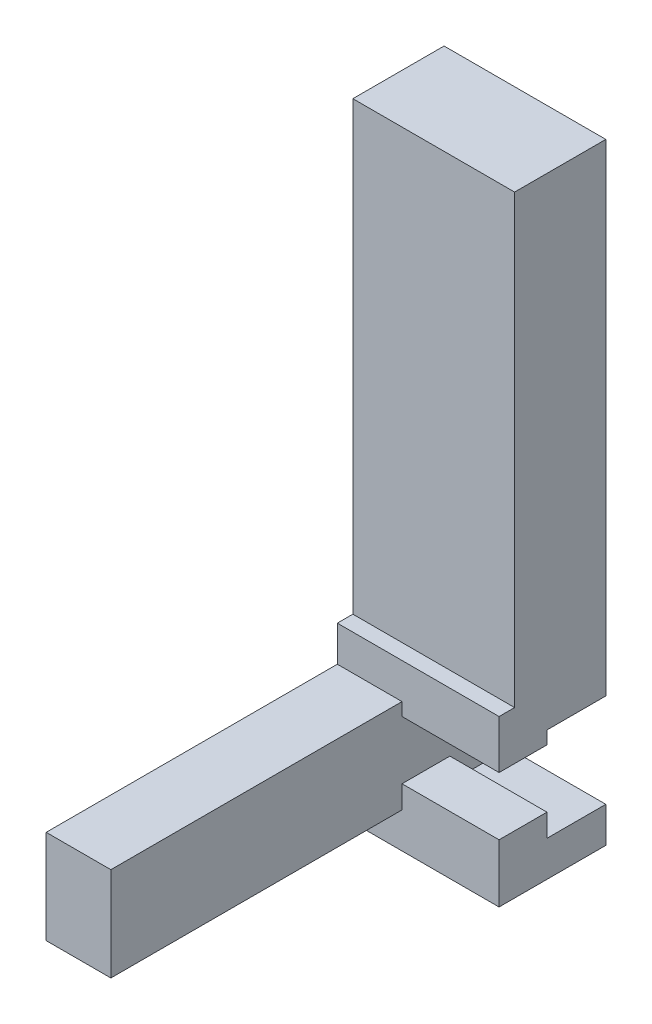
ISO-10303-21;
HEADER;
FILE_DESCRIPTION(('STEP AP214'),'2;1');
FILE_NAME('part.step','',(''),(''),'','','');
FILE_SCHEMA(('AUTOMOTIVE_DESIGN { 1 0 10303 214 1 1 1 1 }'));
ENDSEC;
DATA;
#1=APPLICATION_CONTEXT('core data for automotive mechanical design processes');
#2=APPLICATION_PROTOCOL_DEFINITION('international standard','automotive_design',2000,#1);
#3=PRODUCT_CONTEXT('',#1,'mechanical');
#4=PRODUCT('Part','Part','',(#3));
#5=PRODUCT_RELATED_PRODUCT_CATEGORY('part','',(#4));
#6=PRODUCT_DEFINITION_FORMATION('','',#4);
#7=PRODUCT_DEFINITION_CONTEXT('part definition',#1,'design');
#8=PRODUCT_DEFINITION('design','',#6,#7);
#9=PRODUCT_DEFINITION_SHAPE('','',#8);
#10=(LENGTH_UNIT() NAMED_UNIT(*) SI_UNIT(.MILLI.,.METRE.));
#11=(NAMED_UNIT(*) PLANE_ANGLE_UNIT() SI_UNIT($,.RADIAN.));
#12=(NAMED_UNIT(*) SI_UNIT($,.STERADIAN.) SOLID_ANGLE_UNIT());
#13=UNCERTAINTY_MEASURE_WITH_UNIT(LENGTH_MEASURE(1.E-05),#10,'distance_accuracy_value','');
#14=(GEOMETRIC_REPRESENTATION_CONTEXT(3) GLOBAL_UNCERTAINTY_ASSIGNED_CONTEXT((#13)) GLOBAL_UNIT_ASSIGNED_CONTEXT((#10,
#11,#12)) REPRESENTATION_CONTEXT('',''));
#15=CARTESIAN_POINT('',(0.,0.,0.));
#16=DIRECTION('',(0.,0.,1.));
#17=DIRECTION('',(1.,0.,0.));
#18=AXIS2_PLACEMENT_3D('',#15,#16,#17);
#19=CARTESIAN_POINT('',(1.,2.9,6.));
#20=DIRECTION('',(-1.,0.,0.));
#21=DIRECTION('',(0.,0.,1.));
#22=AXIS2_PLACEMENT_3D('',#19,#20,#21);
#23=PLANE('',#22);
#24=DIRECTION('',(0.,-1.,0.));
#25=VECTOR('',#24,1.);
#26=CARTESIAN_POINT('',(1.,2.9,-4.18));
#27=LINE('',#26,#25);
#28=CARTESIAN_POINT('',(1.,0.7,-4.18));
#29=VERTEX_POINT('',#28);
#30=CARTESIAN_POINT('',(1.,0.,-4.18));
#31=VERTEX_POINT('',#30);
#32=EDGE_CURVE('E254',#29,#31,#27,.T.);
#33=ORIENTED_EDGE('',*,*,#32,.T.);
#34=DIRECTION('',(0.,0.,-1.));
#35=VECTOR('',#34,1.);
#36=CARTESIAN_POINT('',(1.,0.,6.));
#37=LINE('',#36,#35);
#38=CARTESIAN_POINT('',(1.,0.,-6.));
#39=VERTEX_POINT('',#38);
#40=EDGE_CURVE('E288',#31,#39,#37,.T.);
#41=ORIENTED_EDGE('',*,*,#40,.T.);
#42=DIRECTION('',(0.,-1.,0.));
#43=VECTOR('',#42,1.);
#44=CARTESIAN_POINT('',(1.,2.9,-6.));
#45=LINE('',#44,#43);
#46=CARTESIAN_POINT('',(1.,2.9,-6.));
#47=VERTEX_POINT('',#46);
#48=EDGE_CURVE('E169',#47,#39,#45,.T.);
#49=ORIENTED_EDGE('',*,*,#48,.F.);
#50=DIRECTION('',(0.,0.,-1.));
#51=VECTOR('',#50,1.);
#52=CARTESIAN_POINT('',(1.,2.9,6.));
#53=LINE('',#52,#51);
#54=CARTESIAN_POINT('',(1.,2.9,-4.18));
#55=VERTEX_POINT('',#54);
#56=EDGE_CURVE('E48',#55,#47,#53,.T.);
#57=ORIENTED_EDGE('',*,*,#56,.F.);
#58=DIRECTION('',(0.,-1.,0.));
#59=VECTOR('',#58,1.);
#60=CARTESIAN_POINT('',(1.,2.9,-4.18));
#61=LINE('',#60,#59);
#62=CARTESIAN_POINT('',(1.,2.5,-4.18));
#63=VERTEX_POINT('',#62);
#64=EDGE_CURVE('E266',#55,#63,#61,.T.);
#65=ORIENTED_EDGE('',*,*,#64,.T.);
#66=DIRECTION('',(0.,0.,1.));
#67=VECTOR('',#66,1.);
#68=CARTESIAN_POINT('',(1.,2.5,6.));
#69=LINE('',#68,#67);
#70=CARTESIAN_POINT('',(1.,2.5,-2.7));
#71=VERTEX_POINT('',#70);
#72=EDGE_CURVE('E286',#63,#71,#69,.T.);
#73=ORIENTED_EDGE('',*,*,#72,.T.);
#74=DIRECTION('',(0.,1.,0.));
#75=VECTOR('',#74,1.);
#76=CARTESIAN_POINT('',(1.,2.9,-2.7));
#77=LINE('',#76,#75);
#78=CARTESIAN_POINT('',(1.,2.9,-2.7));
#79=VERTEX_POINT('',#78);
#80=EDGE_CURVE('E284',#71,#79,#77,.T.);
#81=ORIENTED_EDGE('',*,*,#80,.T.);
#82=CARTESIAN_POINT('',(1.,2.9,6.3));
#83=VERTEX_POINT('',#82);
#84=EDGE_CURVE('E289',#83,#79,#53,.T.);
#85=ORIENTED_EDGE('',*,*,#84,.F.);
#86=DIRECTION('',(0.,1.,0.));
#87=VECTOR('',#86,1.);
#88=CARTESIAN_POINT('',(1.,2.9,6.3));
#89=LINE('',#88,#87);
#90=CARTESIAN_POINT('',(1.,0.,6.3));
#91=VERTEX_POINT('',#90);
#92=EDGE_CURVE('E224',#91,#83,#89,.T.);
#93=ORIENTED_EDGE('',*,*,#92,.F.);
#94=CARTESIAN_POINT('',(1.,0.,-2.7));
#95=VERTEX_POINT('',#94);
#96=EDGE_CURVE('E293',#91,#95,#37,.T.);
#97=ORIENTED_EDGE('',*,*,#96,.T.);
#98=DIRECTION('',(0.,1.,0.));
#99=VECTOR('',#98,1.);
#100=CARTESIAN_POINT('',(1.,2.9,-2.7));
#101=LINE('',#100,#99);
#102=CARTESIAN_POINT('',(1.,0.7,-2.7));
#103=VERTEX_POINT('',#102);
#104=EDGE_CURVE('E180',#95,#103,#101,.T.);
#105=ORIENTED_EDGE('',*,*,#104,.T.);
#106=DIRECTION('',(0.,0.,-1.));
#107=VECTOR('',#106,1.);
#108=CARTESIAN_POINT('',(1.,0.699999999999998,6.));
#109=LINE('',#108,#107);
#110=EDGE_CURVE('E257',#103,#29,#109,.T.);
#111=ORIENTED_EDGE('',*,*,#110,.T.);
#112=EDGE_LOOP('',(#33,#41,#49,#57,#65,#73,#81,#85,#93,#97,#105,#111));
#113=FACE_BOUND('',#112,.T.);
#114=ADVANCED_FACE('F34',(#113),#23,.F.);
#115=CARTESIAN_POINT('',(-3.33032186618072,0.7,-4.18));
#116=DIRECTION('',(0.,0.,-1.));
#117=DIRECTION('',(-1.,0.,0.));
#118=AXIS2_PLACEMENT_3D('',#115,#116,#117);
#119=PLANE('',#118);
#120=DIRECTION('',(0.,1.,0.));
#121=VECTOR('',#120,1.);
#122=CARTESIAN_POINT('',(4.,0.7,-4.18));
#123=LINE('',#122,#121);
#124=CARTESIAN_POINT('',(4.,0.,-4.18));
#125=VERTEX_POINT('',#124);
#126=CARTESIAN_POINT('',(4.,0.7,-4.18));
#127=VERTEX_POINT('',#126);
#128=EDGE_CURVE('E233',#125,#127,#123,.T.);
#129=ORIENTED_EDGE('',*,*,#128,.F.);
#130=DIRECTION('',(-1.,0.,0.));
#131=VECTOR('',#130,1.);
#132=CARTESIAN_POINT('',(-3.33032186618072,0.,-4.18));
#133=LINE('',#132,#131);
#134=EDGE_CURVE('E195',#125,#31,#133,.T.);
#135=ORIENTED_EDGE('',*,*,#134,.T.);
#136=ORIENTED_EDGE('',*,*,#32,.F.);
#137=DIRECTION('',(1.,0.,0.));
#138=VECTOR('',#137,1.);
#139=CARTESIAN_POINT('',(-3.33032186618072,0.7,-4.18));
#140=LINE('',#139,#138);
#141=EDGE_CURVE('E246',#29,#127,#140,.T.);
#142=ORIENTED_EDGE('',*,*,#141,.T.);
#143=EDGE_LOOP('',(#129,#135,#136,#142));
#144=FACE_BOUND('',#143,.T.);
#145=ADVANCED_FACE('F352',(#144),#119,.T.);
#146=CARTESIAN_POINT('',(-3.33032186618072,2.5,-4.18));
#147=DIRECTION('',(0.,0.,-1.));
#148=DIRECTION('',(-1.,0.,0.));
#149=AXIS2_PLACEMENT_3D('',#146,#147,#148);
#150=PLANE('',#149);
#151=ORIENTED_EDGE('',*,*,#64,.F.);
#152=DIRECTION('',(1.,0.,0.));
#153=VECTOR('',#152,1.);
#154=CARTESIAN_POINT('',(-3.33032186618072,2.9,-4.18));
#155=LINE('',#154,#153);
#156=CARTESIAN_POINT('',(4.,2.9,-4.18));
#157=VERTEX_POINT('',#156);
#158=EDGE_CURVE('E208',#55,#157,#155,.T.);
#159=ORIENTED_EDGE('',*,*,#158,.T.);
#160=DIRECTION('',(0.,1.,0.));
#161=VECTOR('',#160,1.);
#162=CARTESIAN_POINT('',(4.,2.5,-4.18));
#163=LINE('',#162,#161);
#164=CARTESIAN_POINT('',(4.,2.5,-4.18));
#165=VERTEX_POINT('',#164);
#166=EDGE_CURVE('E272',#165,#157,#163,.T.);
#167=ORIENTED_EDGE('',*,*,#166,.F.);
#168=DIRECTION('',(1.,0.,0.));
#169=VECTOR('',#168,1.);
#170=CARTESIAN_POINT('',(-3.33032186618072,2.5,-4.18));
#171=LINE('',#170,#169);
#172=EDGE_CURVE('E280',#63,#165,#171,.T.);
#173=ORIENTED_EDGE('',*,*,#172,.F.);
#174=EDGE_LOOP('',(#151,#159,#167,#173));
#175=FACE_BOUND('',#174,.T.);
#176=ADVANCED_FACE('F325',(#175),#150,.T.);
#177=CARTESIAN_POINT('',(-3.33032186618072,4.,-2.7));
#178=DIRECTION('',(0.,1.,0.));
#179=DIRECTION('',(0.,0.,1.));
#180=AXIS2_PLACEMENT_3D('',#177,#178,#179);
#181=PLANE('',#180);
#182=DIRECTION('',(0.,0.,1.));
#183=VECTOR('',#182,1.);
#184=CARTESIAN_POINT('',(4.,4.,-2.7));
#185=LINE('',#184,#183);
#186=CARTESIAN_POINT('',(4.,4.,-3.18));
#187=VERTEX_POINT('',#186);
#188=CARTESIAN_POINT('',(4.,4.,-2.7));
#189=VERTEX_POINT('',#188);
#190=EDGE_CURVE('E275',#187,#189,#185,.T.);
#191=ORIENTED_EDGE('',*,*,#190,.F.);
#192=DIRECTION('',(1.,0.,0.));
#193=VECTOR('',#192,1.);
#194=CARTESIAN_POINT('',(-3.33032186618072,4.,-3.18));
#195=LINE('',#194,#193);
#196=CARTESIAN_POINT('',(-1.,4.,-3.18));
#197=VERTEX_POINT('',#196);
#198=EDGE_CURVE('E56',#197,#187,#195,.T.);
#199=ORIENTED_EDGE('',*,*,#198,.F.);
#200=DIRECTION('',(0.,0.,-1.));
#201=VECTOR('',#200,1.);
#202=CARTESIAN_POINT('',(-1.,4.,-2.7));
#203=LINE('',#202,#201);
#204=CARTESIAN_POINT('',(-1.,4.,-2.7));
#205=VERTEX_POINT('',#204);
#206=EDGE_CURVE('E260',#205,#197,#203,.T.);
#207=ORIENTED_EDGE('',*,*,#206,.F.);
#208=DIRECTION('',(1.,0.,0.));
#209=VECTOR('',#208,1.);
#210=CARTESIAN_POINT('',(-3.33032186618072,4.,-2.7));
#211=LINE('',#210,#209);
#212=EDGE_CURVE('E264',#205,#189,#211,.T.);
#213=ORIENTED_EDGE('',*,*,#212,.T.);
#214=EDGE_LOOP('',(#191,#199,#207,#213));
#215=FACE_BOUND('',#214,.T.);
#216=ADVANCED_FACE('F311',(#215),#181,.T.);
#217=CARTESIAN_POINT('',(0.,2.9,0.));
#218=DIRECTION('',(0.,-1.,0.));
#219=DIRECTION('',(0.,0.,-1.));
#220=AXIS2_PLACEMENT_3D('',#217,#218,#219);
#221=PLANE('',#220);
#222=ORIENTED_EDGE('',*,*,#84,.T.);
#223=DIRECTION('',(-1.,0.,0.));
#224=VECTOR('',#223,1.);
#225=CARTESIAN_POINT('',(0.,2.9,-2.7));
#226=LINE('',#225,#224);
#227=CARTESIAN_POINT('',(-1.,2.9,-2.7));
#228=VERTEX_POINT('',#227);
#229=EDGE_CURVE('E41',#79,#228,#226,.T.);
#230=ORIENTED_EDGE('',*,*,#229,.T.);
#231=DIRECTION('',(0.,0.,1.));
#232=VECTOR('',#231,1.);
#233=CARTESIAN_POINT('',(-1.,2.9,6.));
#234=LINE('',#233,#232);
#235=CARTESIAN_POINT('',(-1.,2.9,6.3));
#236=VERTEX_POINT('',#235);
#237=EDGE_CURVE('E170',#228,#236,#234,.T.);
#238=ORIENTED_EDGE('',*,*,#237,.T.);
#239=DIRECTION('',(-1.,0.,0.));
#240=VECTOR('',#239,1.);
#241=CARTESIAN_POINT('',(1.,2.9,6.3));
#242=LINE('',#241,#240);
#243=EDGE_CURVE('E230',#83,#236,#242,.T.);
#244=ORIENTED_EDGE('',*,*,#243,.F.);
#245=EDGE_LOOP('',(#222,#230,#238,#244));
#246=FACE_BOUND('',#245,.T.);
#247=ADVANCED_FACE('F302',(#246),#221,.F.);
#248=CARTESIAN_POINT('',(-1.,2.9,-6.));
#249=DIRECTION('',(0.,0.,1.));
#250=DIRECTION('',(1.,0.,0.));
#251=AXIS2_PLACEMENT_3D('',#248,#249,#250);
#252=PLANE('',#251);
#253=ORIENTED_EDGE('',*,*,#48,.T.);
#254=DIRECTION('',(-1.,0.,0.));
#255=VECTOR('',#254,1.);
#256=CARTESIAN_POINT('',(19.1645112021456,0.,-6.));
#257=LINE('',#256,#255);
#258=CARTESIAN_POINT('',(4.,0.,-6.));
#259=VERTEX_POINT('',#258);
#260=EDGE_CURVE('E189',#259,#39,#257,.T.);
#261=ORIENTED_EDGE('',*,*,#260,.F.);
#262=DIRECTION('',(0.,-1.,0.));
#263=VECTOR('',#262,1.);
#264=CARTESIAN_POINT('',(4.,2.9,-6.));
#265=LINE('',#264,#263);
#266=CARTESIAN_POINT('',(4.,-1.1,-6.));
#267=VERTEX_POINT('',#266);
#268=EDGE_CURVE('E187',#259,#267,#265,.T.);
#269=ORIENTED_EDGE('',*,*,#268,.T.);
#270=DIRECTION('',(-1.,0.,0.));
#271=VECTOR('',#270,1.);
#272=CARTESIAN_POINT('',(19.1645112021456,-1.1,-6.));
#273=LINE('',#272,#271);
#274=CARTESIAN_POINT('',(-1.,-1.1,-6.));
#275=VERTEX_POINT('',#274);
#276=EDGE_CURVE('E177',#267,#275,#273,.T.);
#277=ORIENTED_EDGE('',*,*,#276,.T.);
#278=DIRECTION('',(0.,-1.,0.));
#279=VECTOR('',#278,1.);
#280=CARTESIAN_POINT('',(-1.,2.9,-6.));
#281=LINE('',#280,#279);
#282=CARTESIAN_POINT('',(-1.,17.8,-6.));
#283=VERTEX_POINT('',#282);
#284=EDGE_CURVE('E158',#283,#275,#281,.T.);
#285=ORIENTED_EDGE('',*,*,#284,.F.);
#286=DIRECTION('',(-1.,0.,0.));
#287=VECTOR('',#286,1.);
#288=CARTESIAN_POINT('',(19.1645112021456,17.8,-6.));
#289=LINE('',#288,#287);
#290=CARTESIAN_POINT('',(4.,17.8,-6.));
#291=VERTEX_POINT('',#290);
#292=EDGE_CURVE('E198',#291,#283,#289,.T.);
#293=ORIENTED_EDGE('',*,*,#292,.F.);
#294=DIRECTION('',(0.,-1.,0.));
#295=VECTOR('',#294,1.);
#296=CARTESIAN_POINT('',(4.,2.9,-6.));
#297=LINE('',#296,#295);
#298=CARTESIAN_POINT('',(4.,2.9,-6.));
#299=VERTEX_POINT('',#298);
#300=EDGE_CURVE('E199',#291,#299,#297,.T.);
#301=ORIENTED_EDGE('',*,*,#300,.T.);
#302=DIRECTION('',(-1.,0.,0.));
#303=VECTOR('',#302,1.);
#304=CARTESIAN_POINT('',(19.1645112021456,2.9,-6.));
#305=LINE('',#304,#303);
#306=EDGE_CURVE('E210',#299,#47,#305,.T.);
#307=ORIENTED_EDGE('',*,*,#306,.T.);
#308=EDGE_LOOP('',(#253,#261,#269,#277,#285,#293,#301,#307));
#309=FACE_BOUND('',#308,.T.);
#310=ADVANCED_FACE('F184',(#309),#252,.F.);
#311=CARTESIAN_POINT('',(-1.,2.9,6.));
#312=DIRECTION('',(1.,0.,0.));
#313=DIRECTION('',(0.,0.,-1.));
#314=AXIS2_PLACEMENT_3D('',#311,#312,#313);
#315=PLANE('',#314);
#316=DIRECTION('',(0.,0.,1.));
#317=VECTOR('',#316,1.);
#318=CARTESIAN_POINT('',(-1.,-1.1,-4.18));
#319=LINE('',#318,#317);
#320=CARTESIAN_POINT('',(-1.,-1.1,-2.7));
#321=VERTEX_POINT('',#320);
#322=EDGE_CURVE('E161',#275,#321,#319,.T.);
#323=ORIENTED_EDGE('',*,*,#322,.T.);
#324=DIRECTION('',(0.,1.,0.));
#325=VECTOR('',#324,1.);
#326=CARTESIAN_POINT('',(-1.,0.7,-2.7));
#327=LINE('',#326,#325);
#328=CARTESIAN_POINT('',(-1.,0.,-2.7));
#329=VERTEX_POINT('',#328);
#330=EDGE_CURVE('E181',#321,#329,#327,.T.);
#331=ORIENTED_EDGE('',*,*,#330,.T.);
#332=DIRECTION('',(0.,0.,1.));
#333=VECTOR('',#332,1.);
#334=CARTESIAN_POINT('',(-1.,0.,6.));
#335=LINE('',#334,#333);
#336=CARTESIAN_POINT('',(-1.,0.,6.3));
#337=VERTEX_POINT('',#336);
#338=EDGE_CURVE('E296',#329,#337,#335,.T.);
#339=ORIENTED_EDGE('',*,*,#338,.T.);
#340=DIRECTION('',(0.,1.,0.));
#341=VECTOR('',#340,1.);
#342=CARTESIAN_POINT('',(-1.,2.9,6.3));
#343=LINE('',#342,#341);
#344=EDGE_CURVE('E223',#337,#236,#343,.T.);
#345=ORIENTED_EDGE('',*,*,#344,.T.);
#346=ORIENTED_EDGE('',*,*,#237,.F.);
#347=DIRECTION('',(0.,1.,0.));
#348=VECTOR('',#347,1.);
#349=CARTESIAN_POINT('',(-1.,2.5,-2.7));
#350=LINE('',#349,#348);
#351=EDGE_CURVE('E263',#228,#205,#350,.T.);
#352=ORIENTED_EDGE('',*,*,#351,.T.);
#353=ORIENTED_EDGE('',*,*,#206,.T.);
#354=DIRECTION('',(0.,-1.,0.));
#355=VECTOR('',#354,1.);
#356=CARTESIAN_POINT('',(-1.,17.8,-3.18));
#357=LINE('',#356,#355);
#358=CARTESIAN_POINT('',(-1.,17.8,-3.18));
#359=VERTEX_POINT('',#358);
#360=EDGE_CURVE('E220',#359,#197,#357,.T.);
#361=ORIENTED_EDGE('',*,*,#360,.F.);
#362=DIRECTION('',(0.,0.,-1.));
#363=VECTOR('',#362,1.);
#364=CARTESIAN_POINT('',(-1.,17.8,-4.18));
#365=LINE('',#364,#363);
#366=EDGE_CURVE('E164',#359,#283,#365,.T.);
#367=ORIENTED_EDGE('',*,*,#366,.T.);
#368=ORIENTED_EDGE('',*,*,#284,.T.);
#369=EDGE_LOOP('',(#323,#331,#339,#345,#346,#352,#353,#361,#367,#368));
#370=FACE_BOUND('',#369,.T.);
#371=ADVANCED_FACE('F160',(#370),#315,.F.);
#372=CARTESIAN_POINT('',(0.,0.,0.));
#373=DIRECTION('',(0.,-1.,0.));
#374=DIRECTION('',(0.,0.,-1.));
#375=AXIS2_PLACEMENT_3D('',#372,#373,#374);
#376=PLANE('',#375);
#377=DIRECTION('',(-1.,0.,0.));
#378=VECTOR('',#377,1.);
#379=CARTESIAN_POINT('',(0.,0.,-2.7));
#380=LINE('',#379,#378);
#381=EDGE_CURVE('E11',#95,#329,#380,.T.);
#382=ORIENTED_EDGE('',*,*,#381,.F.);
#383=ORIENTED_EDGE('',*,*,#96,.F.);
#384=DIRECTION('',(-1.,0.,0.));
#385=VECTOR('',#384,1.);
#386=CARTESIAN_POINT('',(1.,0.,6.3));
#387=LINE('',#386,#385);
#388=EDGE_CURVE('E227',#91,#337,#387,.T.);
#389=ORIENTED_EDGE('',*,*,#388,.T.);
#390=ORIENTED_EDGE('',*,*,#338,.F.);
#391=EDGE_LOOP('',(#382,#383,#389,#390));
#392=FACE_BOUND('',#391,.T.);
#393=ADVANCED_FACE('F340',(#392),#376,.T.);
#394=CARTESIAN_POINT('',(-3.33032186618072,2.5,-2.7));
#395=DIRECTION('',(0.,-1.,0.));
#396=DIRECTION('',(0.,0.,-1.));
#397=AXIS2_PLACEMENT_3D('',#394,#395,#396);
#398=PLANE('',#397);
#399=ORIENTED_EDGE('',*,*,#72,.F.);
#400=ORIENTED_EDGE('',*,*,#172,.T.);
#401=DIRECTION('',(0.,0.,-1.));
#402=VECTOR('',#401,1.);
#403=CARTESIAN_POINT('',(4.,2.5,-2.7));
#404=LINE('',#403,#402);
#405=CARTESIAN_POINT('',(4.,2.5,-2.7));
#406=VERTEX_POINT('',#405);
#407=EDGE_CURVE('E269',#406,#165,#404,.T.);
#408=ORIENTED_EDGE('',*,*,#407,.F.);
#409=DIRECTION('',(1.,0.,0.));
#410=VECTOR('',#409,1.);
#411=CARTESIAN_POINT('',(-3.33032186618072,2.5,-2.7));
#412=LINE('',#411,#410);
#413=EDGE_CURVE('E277',#71,#406,#412,.T.);
#414=ORIENTED_EDGE('',*,*,#413,.F.);
#415=EDGE_LOOP('',(#399,#400,#408,#414));
#416=FACE_BOUND('',#415,.T.);
#417=ADVANCED_FACE('F330',(#416),#398,.T.);
#418=CARTESIAN_POINT('',(-3.33032186618072,2.5,-2.7));
#419=DIRECTION('',(0.,0.,1.));
#420=DIRECTION('',(1.,0.,0.));
#421=AXIS2_PLACEMENT_3D('',#418,#419,#420);
#422=PLANE('',#421);
#423=ORIENTED_EDGE('',*,*,#80,.F.);
#424=ORIENTED_EDGE('',*,*,#413,.T.);
#425=DIRECTION('',(0.,-1.,0.));
#426=VECTOR('',#425,1.);
#427=CARTESIAN_POINT('',(4.,2.5,-2.7));
#428=LINE('',#427,#426);
#429=EDGE_CURVE('E259',#189,#406,#428,.T.);
#430=ORIENTED_EDGE('',*,*,#429,.F.);
#431=ORIENTED_EDGE('',*,*,#212,.F.);
#432=ORIENTED_EDGE('',*,*,#351,.F.);
#433=ORIENTED_EDGE('',*,*,#229,.F.);
#434=EDGE_LOOP('',(#423,#424,#430,#431,#432,#433));
#435=FACE_BOUND('',#434,.T.);
#436=ADVANCED_FACE('F307',(#435),#422,.T.);
#437=CARTESIAN_POINT('',(4.,0.,0.));
#438=DIRECTION('',(-1.,0.,0.));
#439=DIRECTION('',(0.,0.,1.));
#440=AXIS2_PLACEMENT_3D('',#437,#438,#439);
#441=PLANE('',#440);
#442=ORIENTED_EDGE('',*,*,#166,.T.);
#443=DIRECTION('',(0.,0.,1.));
#444=VECTOR('',#443,1.);
#445=CARTESIAN_POINT('',(4.,2.9,6.));
#446=LINE('',#445,#444);
#447=EDGE_CURVE('E202',#299,#157,#446,.T.);
#448=ORIENTED_EDGE('',*,*,#447,.F.);
#449=ORIENTED_EDGE('',*,*,#300,.F.);
#450=DIRECTION('',(0.,0.,-1.));
#451=VECTOR('',#450,1.);
#452=CARTESIAN_POINT('',(4.,17.8,6.));
#453=LINE('',#452,#451);
#454=CARTESIAN_POINT('',(4.,17.8,-3.18));
#455=VERTEX_POINT('',#454);
#456=EDGE_CURVE('E203',#455,#291,#453,.T.);
#457=ORIENTED_EDGE('',*,*,#456,.F.);
#458=DIRECTION('',(0.,1.,0.));
#459=VECTOR('',#458,1.);
#460=CARTESIAN_POINT('',(4.,2.9,-3.18));
#461=LINE('',#460,#459);
#462=EDGE_CURVE('E206',#187,#455,#461,.T.);
#463=ORIENTED_EDGE('',*,*,#462,.F.);
#464=ORIENTED_EDGE('',*,*,#190,.T.);
#465=ORIENTED_EDGE('',*,*,#429,.T.);
#466=ORIENTED_EDGE('',*,*,#407,.T.);
#467=EDGE_LOOP('',(#442,#448,#449,#457,#463,#464,#465,#466));
#468=FACE_BOUND('',#467,.T.);
#469=ADVANCED_FACE('F315',(#468),#441,.F.);
#470=CARTESIAN_POINT('',(-3.33032186618072,0.7,-4.18));
#471=DIRECTION('',(0.,1.,0.));
#472=DIRECTION('',(0.,0.,1.));
#473=AXIS2_PLACEMENT_3D('',#470,#471,#472);
#474=PLANE('',#473);
#475=ORIENTED_EDGE('',*,*,#110,.F.);
#476=DIRECTION('',(1.,0.,0.));
#477=VECTOR('',#476,1.);
#478=CARTESIAN_POINT('',(-3.33032186618072,0.7,-2.7));
#479=LINE('',#478,#477);
#480=CARTESIAN_POINT('',(4.,0.7,-2.7));
#481=VERTEX_POINT('',#480);
#482=EDGE_CURVE('E248',#103,#481,#479,.T.);
#483=ORIENTED_EDGE('',*,*,#482,.T.);
#484=DIRECTION('',(0.,0.,1.));
#485=VECTOR('',#484,1.);
#486=CARTESIAN_POINT('',(4.,0.7,-4.18));
#487=LINE('',#486,#485);
#488=EDGE_CURVE('E238',#127,#481,#487,.T.);
#489=ORIENTED_EDGE('',*,*,#488,.F.);
#490=ORIENTED_EDGE('',*,*,#141,.F.);
#491=EDGE_LOOP('',(#475,#483,#489,#490));
#492=FACE_BOUND('',#491,.T.);
#493=ADVANCED_FACE('F348',(#492),#474,.T.);
#494=CARTESIAN_POINT('',(-3.33032186618072,0.7,-2.7));
#495=DIRECTION('',(0.,0.,1.));
#496=DIRECTION('',(0.,-1.,0.));
#497=AXIS2_PLACEMENT_3D('',#494,#495,#496);
#498=PLANE('',#497);
#499=ORIENTED_EDGE('',*,*,#104,.F.);
#500=ORIENTED_EDGE('',*,*,#381,.T.);
#501=ORIENTED_EDGE('',*,*,#330,.F.);
#502=DIRECTION('',(1.,0.,0.));
#503=VECTOR('',#502,1.);
#504=CARTESIAN_POINT('',(-3.33032186618072,-1.1,-2.7));
#505=LINE('',#504,#503);
#506=CARTESIAN_POINT('',(4.,-1.1,-2.7));
#507=VERTEX_POINT('',#506);
#508=EDGE_CURVE('E179',#321,#507,#505,.T.);
#509=ORIENTED_EDGE('',*,*,#508,.T.);
#510=DIRECTION('',(0.,-1.,0.));
#511=VECTOR('',#510,1.);
#512=CARTESIAN_POINT('',(4.,0.7,-2.7));
#513=LINE('',#512,#511);
#514=EDGE_CURVE('E241',#481,#507,#513,.T.);
#515=ORIENTED_EDGE('',*,*,#514,.F.);
#516=ORIENTED_EDGE('',*,*,#482,.F.);
#517=EDGE_LOOP('',(#499,#500,#501,#509,#515,#516));
#518=FACE_BOUND('',#517,.T.);
#519=ADVANCED_FACE('F344',(#518),#498,.T.);
#520=CARTESIAN_POINT('',(-3.33032186618072,-1.1,-4.18));
#521=DIRECTION('',(0.,-1.,0.));
#522=DIRECTION('',(0.,0.,-1.));
#523=AXIS2_PLACEMENT_3D('',#520,#521,#522);
#524=PLANE('',#523);
#525=ORIENTED_EDGE('',*,*,#276,.F.);
#526=DIRECTION('',(0.,0.,-1.));
#527=VECTOR('',#526,1.);
#528=CARTESIAN_POINT('',(4.,-1.1,-4.18));
#529=LINE('',#528,#527);
#530=EDGE_CURVE('E244',#507,#267,#529,.T.);
#531=ORIENTED_EDGE('',*,*,#530,.F.);
#532=ORIENTED_EDGE('',*,*,#508,.F.);
#533=ORIENTED_EDGE('',*,*,#322,.F.);
#534=EDGE_LOOP('',(#525,#531,#532,#533));
#535=FACE_BOUND('',#534,.T.);
#536=ADVANCED_FACE('F175',(#535),#524,.T.);
#537=CARTESIAN_POINT('',(4.,0.,0.));
#538=DIRECTION('',(-1.,0.,0.));
#539=DIRECTION('',(0.,0.,1.));
#540=AXIS2_PLACEMENT_3D('',#537,#538,#539);
#541=PLANE('',#540);
#542=ORIENTED_EDGE('',*,*,#530,.T.);
#543=ORIENTED_EDGE('',*,*,#268,.F.);
#544=DIRECTION('',(0.,0.,-1.));
#545=VECTOR('',#544,1.);
#546=CARTESIAN_POINT('',(4.,0.,6.));
#547=LINE('',#546,#545);
#548=EDGE_CURVE('E188',#125,#259,#547,.T.);
#549=ORIENTED_EDGE('',*,*,#548,.F.);
#550=ORIENTED_EDGE('',*,*,#128,.T.);
#551=ORIENTED_EDGE('',*,*,#488,.T.);
#552=ORIENTED_EDGE('',*,*,#514,.T.);
#553=EDGE_LOOP('',(#542,#543,#549,#550,#551,#552));
#554=FACE_BOUND('',#553,.T.);
#555=ADVANCED_FACE('F358',(#554),#541,.F.);
#556=CARTESIAN_POINT('',(1.,2.9,6.3));
#557=DIRECTION('',(0.,0.,1.));
#558=DIRECTION('',(1.,0.,0.));
#559=AXIS2_PLACEMENT_3D('',#556,#557,#558);
#560=PLANE('',#559);
#561=ORIENTED_EDGE('',*,*,#344,.F.);
#562=ORIENTED_EDGE('',*,*,#388,.F.);
#563=ORIENTED_EDGE('',*,*,#92,.T.);
#564=ORIENTED_EDGE('',*,*,#243,.T.);
#565=EDGE_LOOP('',(#561,#562,#563,#564));
#566=FACE_BOUND('',#565,.T.);
#567=ADVANCED_FACE('F336',(#566),#560,.T.);
#568=CARTESIAN_POINT('',(-3.33032186618072,17.8,-3.18));
#569=DIRECTION('',(0.,0.,1.));
#570=DIRECTION('',(1.,0.,0.));
#571=AXIS2_PLACEMENT_3D('',#568,#569,#570);
#572=PLANE('',#571);
#573=ORIENTED_EDGE('',*,*,#360,.T.);
#574=ORIENTED_EDGE('',*,*,#198,.T.);
#575=ORIENTED_EDGE('',*,*,#462,.T.);
#576=DIRECTION('',(-1.,0.,0.));
#577=VECTOR('',#576,1.);
#578=CARTESIAN_POINT('',(-3.33032186618072,17.8,-3.18));
#579=LINE('',#578,#577);
#580=EDGE_CURVE('E216',#455,#359,#579,.T.);
#581=ORIENTED_EDGE('',*,*,#580,.T.);
#582=EDGE_LOOP('',(#573,#574,#575,#581));
#583=FACE_BOUND('',#582,.T.);
#584=ADVANCED_FACE('F316',(#583),#572,.T.);
#585=CARTESIAN_POINT('',(0.,17.8,0.));
#586=DIRECTION('',(0.,-1.,0.));
#587=DIRECTION('',(0.,0.,-1.));
#588=AXIS2_PLACEMENT_3D('',#585,#586,#587);
#589=PLANE('',#588);
#590=ORIENTED_EDGE('',*,*,#580,.F.);
#591=ORIENTED_EDGE('',*,*,#456,.T.);
#592=ORIENTED_EDGE('',*,*,#292,.T.);
#593=ORIENTED_EDGE('',*,*,#366,.F.);
#594=EDGE_LOOP('',(#590,#591,#592,#593));
#595=FACE_BOUND('',#594,.T.);
#596=ADVANCED_FACE('F318',(#595),#589,.F.);
#597=CARTESIAN_POINT('',(19.1645112021456,2.9,6.));
#598=DIRECTION('',(0.,1.,0.));
#599=DIRECTION('',(0.,0.,1.));
#600=AXIS2_PLACEMENT_3D('',#597,#598,#599);
#601=PLANE('',#600);
#602=ORIENTED_EDGE('',*,*,#158,.F.);
#603=ORIENTED_EDGE('',*,*,#56,.T.);
#604=ORIENTED_EDGE('',*,*,#306,.F.);
#605=ORIENTED_EDGE('',*,*,#447,.T.);
#606=EDGE_LOOP('',(#602,#603,#604,#605));
#607=FACE_BOUND('',#606,.T.);
#608=ADVANCED_FACE('F323',(#607),#601,.F.);
#609=CARTESIAN_POINT('',(19.1645112021456,0.,6.));
#610=DIRECTION('',(0.,-1.,0.));
#611=DIRECTION('',(0.,0.,-1.));
#612=AXIS2_PLACEMENT_3D('',#609,#610,#611);
#613=PLANE('',#612);
#614=ORIENTED_EDGE('',*,*,#260,.T.);
#615=ORIENTED_EDGE('',*,*,#40,.F.);
#616=ORIENTED_EDGE('',*,*,#134,.F.);
#617=ORIENTED_EDGE('',*,*,#548,.T.);
#618=EDGE_LOOP('',(#614,#615,#616,#617));
#619=FACE_BOUND('',#618,.T.);
#620=ADVANCED_FACE('F355',(#619),#613,.F.);
#621=CLOSED_SHELL('',(#114,#145,#176,#216,#247,#310,#371,#393,#417,#436,#469,#493,#519,#536,
#555,#567,#584,#596,#608,#620));
#622=MANIFOLD_SOLID_BREP('B2',#621);
#623=ADVANCED_BREP_SHAPE_REPRESENTATION('',(#18,#622),#14);
#624=SHAPE_DEFINITION_REPRESENTATION(#9,#623);
ENDSEC;
END-ISO-10303-21;
